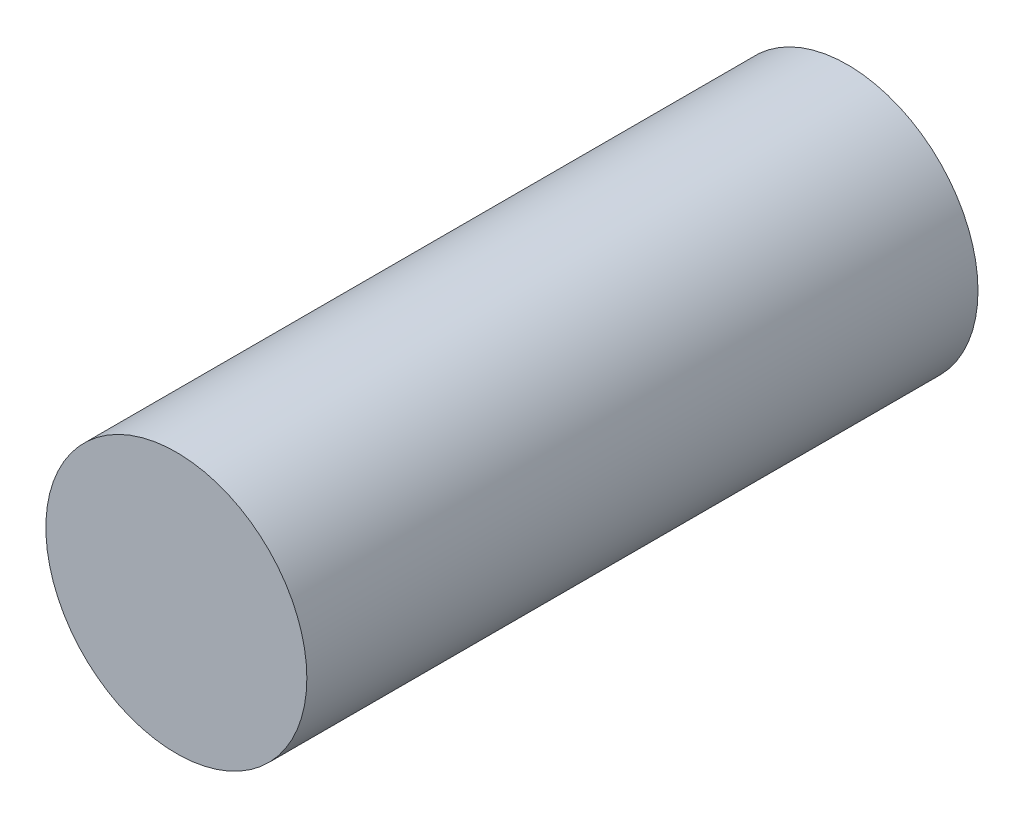
ISO-10303-21;
HEADER;
FILE_DESCRIPTION(('STEP AP214'),'2;1');
FILE_NAME('part.step','',(''),(''),'','','');
FILE_SCHEMA(('AUTOMOTIVE_DESIGN { 1 0 10303 214 1 1 1 1 }'));
ENDSEC;
DATA;
#1=APPLICATION_CONTEXT('core data for automotive mechanical design processes');
#2=APPLICATION_PROTOCOL_DEFINITION('international standard','automotive_design',2000,#1);
#3=PRODUCT_CONTEXT('',#1,'mechanical');
#4=PRODUCT('Part','Part','',(#3));
#5=PRODUCT_RELATED_PRODUCT_CATEGORY('part','',(#4));
#6=PRODUCT_DEFINITION_FORMATION('','',#4);
#7=PRODUCT_DEFINITION_CONTEXT('part definition',#1,'design');
#8=PRODUCT_DEFINITION('design','',#6,#7);
#9=PRODUCT_DEFINITION_SHAPE('','',#8);
#10=(LENGTH_UNIT() NAMED_UNIT(*) SI_UNIT(.MILLI.,.METRE.));
#11=(NAMED_UNIT(*) PLANE_ANGLE_UNIT() SI_UNIT($,.RADIAN.));
#12=(NAMED_UNIT(*) SI_UNIT($,.STERADIAN.) SOLID_ANGLE_UNIT());
#13=UNCERTAINTY_MEASURE_WITH_UNIT(LENGTH_MEASURE(1.E-05),#10,'distance_accuracy_value','');
#14=(GEOMETRIC_REPRESENTATION_CONTEXT(3) GLOBAL_UNCERTAINTY_ASSIGNED_CONTEXT((#13)) GLOBAL_UNIT_ASSIGNED_CONTEXT((#10,
#11,#12)) REPRESENTATION_CONTEXT('',''));
#15=CARTESIAN_POINT('',(0.,0.,0.));
#16=DIRECTION('',(0.,0.,1.));
#17=DIRECTION('',(1.,0.,0.));
#18=AXIS2_PLACEMENT_3D('',#15,#16,#17);
#19=CARTESIAN_POINT('',(0.,0.,36.));
#20=DIRECTION('',(0.,0.,-1.));
#21=DIRECTION('',(-1.,0.,0.));
#22=AXIS2_PLACEMENT_3D('',#19,#20,#21);
#23=CYLINDRICAL_SURFACE('',#22,7.);
#24=CARTESIAN_POINT('',(0.,0.,36.));
#25=DIRECTION('',(0.,0.,1.));
#26=DIRECTION('',(1.,0.,0.));
#27=AXIS2_PLACEMENT_3D('',#24,#25,#26);
#28=CIRCLE('',#27,7.);
#29=CARTESIAN_POINT('',(7.,0.,36.));
#30=VERTEX_POINT('',#29);
#31=EDGE_CURVE('E10',#30,#30,#28,.T.);
#32=ORIENTED_EDGE('',*,*,#31,.F.);
#33=EDGE_LOOP('',(#32));
#34=FACE_BOUND('',#33,.T.);
#35=CARTESIAN_POINT('',(0.,0.,0.));
#36=DIRECTION('',(0.,0.,1.));
#37=DIRECTION('',(1.,0.,0.));
#38=AXIS2_PLACEMENT_3D('',#35,#36,#37);
#39=CIRCLE('',#38,7.);
#40=CARTESIAN_POINT('',(7.,0.,0.));
#41=VERTEX_POINT('',#40);
#42=EDGE_CURVE('E34',#41,#41,#39,.T.);
#43=ORIENTED_EDGE('',*,*,#42,.T.);
#44=EDGE_LOOP('',(#43));
#45=FACE_BOUND('',#44,.T.);
#46=ADVANCED_FACE('F31',(#34,#45),#23,.T.);
#47=CARTESIAN_POINT('',(0.,0.,36.));
#48=DIRECTION('',(0.,0.,1.));
#49=DIRECTION('',(1.,0.,0.));
#50=AXIS2_PLACEMENT_3D('',#47,#48,#49);
#51=PLANE('',#50);
#52=ORIENTED_EDGE('',*,*,#31,.T.);
#53=EDGE_LOOP('',(#52));
#54=FACE_BOUND('',#53,.T.);
#55=ADVANCED_FACE('F46',(#54),#51,.T.);
#56=CARTESIAN_POINT('',(0.,0.,0.));
#57=DIRECTION('',(0.,0.,1.));
#58=DIRECTION('',(1.,0.,0.));
#59=AXIS2_PLACEMENT_3D('',#56,#57,#58);
#60=PLANE('',#59);
#61=ORIENTED_EDGE('',*,*,#42,.F.);
#62=EDGE_LOOP('',(#61));
#63=FACE_BOUND('',#62,.T.);
#64=ADVANCED_FACE('F44',(#63),#60,.F.);
#65=CLOSED_SHELL('',(#46,#55,#64));
#66=MANIFOLD_SOLID_BREP('B2',#65);
#67=ADVANCED_BREP_SHAPE_REPRESENTATION('',(#18,#66),#14);
#68=SHAPE_DEFINITION_REPRESENTATION(#9,#67);
ENDSEC;
END-ISO-10303-21;
